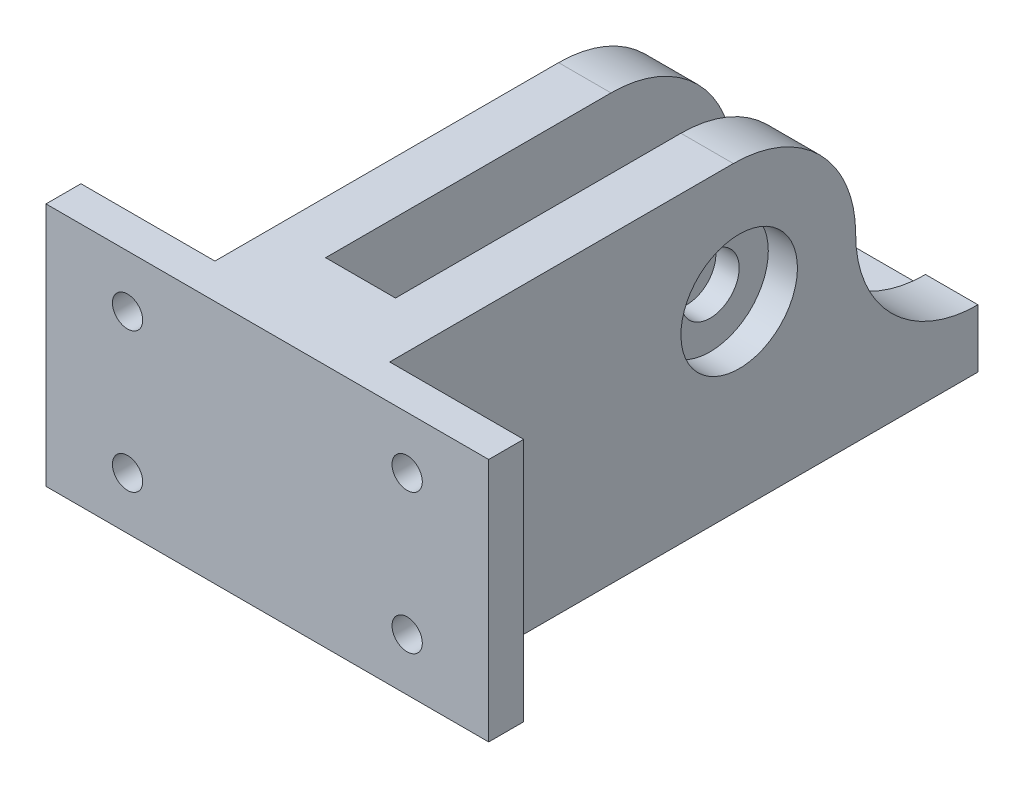
ISO-10303-21;
HEADER;
FILE_DESCRIPTION(('STEP AP214'),'2;1');
FILE_NAME('part.step','',(''),(''),'','','');
FILE_SCHEMA(('AUTOMOTIVE_DESIGN { 1 0 10303 214 1 1 1 1 }'));
ENDSEC;
DATA;
#1=APPLICATION_CONTEXT('core data for automotive mechanical design processes');
#2=APPLICATION_PROTOCOL_DEFINITION('international standard','automotive_design',2000,#1);
#3=PRODUCT_CONTEXT('',#1,'mechanical');
#4=PRODUCT('Part','Part','',(#3));
#5=PRODUCT_RELATED_PRODUCT_CATEGORY('part','',(#4));
#6=PRODUCT_DEFINITION_FORMATION('','',#4);
#7=PRODUCT_DEFINITION_CONTEXT('part definition',#1,'design');
#8=PRODUCT_DEFINITION('design','',#6,#7);
#9=PRODUCT_DEFINITION_SHAPE('','',#8);
#10=(LENGTH_UNIT() NAMED_UNIT(*) SI_UNIT(.MILLI.,.METRE.));
#11=(NAMED_UNIT(*) PLANE_ANGLE_UNIT() SI_UNIT($,.RADIAN.));
#12=(NAMED_UNIT(*) SI_UNIT($,.STERADIAN.) SOLID_ANGLE_UNIT());
#13=UNCERTAINTY_MEASURE_WITH_UNIT(LENGTH_MEASURE(1.E-05),#10,'distance_accuracy_value','');
#14=(GEOMETRIC_REPRESENTATION_CONTEXT(3) GLOBAL_UNCERTAINTY_ASSIGNED_CONTEXT((#13)) GLOBAL_UNIT_ASSIGNED_CONTEXT((#10,
#11,#12)) REPRESENTATION_CONTEXT('',''));
#15=CARTESIAN_POINT('',(0.,0.,0.));
#16=DIRECTION('',(0.,0.,1.));
#17=DIRECTION('',(1.,0.,0.));
#18=AXIS2_PLACEMENT_3D('',#15,#16,#17);
#19=CARTESIAN_POINT('',(-30.3337448559671,-14.862962962963,-50.5));
#20=DIRECTION('',(0.,0.,1.));
#21=DIRECTION('',(1.,0.,0.));
#22=AXIS2_PLACEMENT_3D('',#19,#20,#21);
#23=PLANE('',#22);
#24=DIRECTION('',(0.,-1.,0.));
#25=VECTOR('',#24,1.);
#26=CARTESIAN_POINT('',(-19.8337448559671,-14.862962962963,-50.5));
#27=LINE('',#26,#25);
#28=CARTESIAN_POINT('',(-19.8337448559671,-9.86296296296297,-50.5));
#29=VERTEX_POINT('',#28);
#30=CARTESIAN_POINT('',(-19.8337448559671,-10.862962962963,-50.5));
#31=VERTEX_POINT('',#30);
#32=EDGE_CURVE('E179',#29,#31,#27,.T.);
#33=ORIENTED_EDGE('',*,*,#32,.F.);
#34=DIRECTION('',(1.,0.,0.));
#35=VECTOR('',#34,1.);
#36=CARTESIAN_POINT('',(-30.3337448559671,-9.86296296296297,-50.5));
#37=LINE('',#36,#35);
#38=CARTESIAN_POINT('',(-15.3337448559671,-9.86296296296297,-50.5));
#39=VERTEX_POINT('',#38);
#40=EDGE_CURVE('E205',#29,#39,#37,.T.);
#41=ORIENTED_EDGE('',*,*,#40,.T.);
#42=DIRECTION('',(0.,1.,0.));
#43=VECTOR('',#42,1.);
#44=CARTESIAN_POINT('',(-15.3337448559671,-14.862962962963,-50.5));
#45=LINE('',#44,#43);
#46=CARTESIAN_POINT('',(-15.3337448559671,-14.862962962963,-50.5));
#47=VERTEX_POINT('',#46);
#48=EDGE_CURVE('E201',#47,#39,#45,.T.);
#49=ORIENTED_EDGE('',*,*,#48,.F.);
#50=DIRECTION('',(1.,0.,0.));
#51=VECTOR('',#50,1.);
#52=CARTESIAN_POINT('',(-30.3337448559671,-14.862962962963,-50.5));
#53=LINE('',#52,#51);
#54=CARTESIAN_POINT('',(-30.3337448559671,-14.862962962963,-50.5));
#55=VERTEX_POINT('',#54);
#56=EDGE_CURVE('E196',#55,#47,#53,.T.);
#57=ORIENTED_EDGE('',*,*,#56,.F.);
#58=DIRECTION('',(0.,1.,0.));
#59=VECTOR('',#58,1.);
#60=CARTESIAN_POINT('',(-30.3337448559671,-14.862962962963,-50.5));
#61=LINE('',#60,#59);
#62=CARTESIAN_POINT('',(-30.3337448559671,-9.86296296296297,-50.5));
#63=VERTEX_POINT('',#62);
#64=EDGE_CURVE('E209',#55,#63,#61,.T.);
#65=ORIENTED_EDGE('',*,*,#64,.T.);
#66=CARTESIAN_POINT('',(-25.8337448559671,-9.86296296296297,-50.5));
#67=VERTEX_POINT('',#66);
#68=EDGE_CURVE('E202',#63,#67,#37,.T.);
#69=ORIENTED_EDGE('',*,*,#68,.T.);
#70=DIRECTION('',(0.,1.,0.));
#71=VECTOR('',#70,1.);
#72=CARTESIAN_POINT('',(-25.8337448559671,-14.862962962963,-50.5));
#73=LINE('',#72,#71);
#74=CARTESIAN_POINT('',(-25.8337448559671,-10.862962962963,-50.5));
#75=VERTEX_POINT('',#74);
#76=EDGE_CURVE('E182',#75,#67,#73,.T.);
#77=ORIENTED_EDGE('',*,*,#76,.F.);
#78=DIRECTION('',(-1.,0.,0.));
#79=VECTOR('',#78,1.);
#80=CARTESIAN_POINT('',(-30.3337448559671,-10.862962962963,-50.5));
#81=LINE('',#80,#79);
#82=EDGE_CURVE('E11',#31,#75,#81,.T.);
#83=ORIENTED_EDGE('',*,*,#82,.F.);
#84=EDGE_LOOP('',(#33,#41,#49,#57,#65,#69,#77,#83));
#85=FACE_BOUND('',#84,.T.);
#86=ADVANCED_FACE('F41',(#85),#23,.F.);
#87=CARTESIAN_POINT('',(-41.8337448559671,-9.86296296296297,3.));
#88=DIRECTION('',(0.,1.,0.));
#89=DIRECTION('',(0.,0.,1.));
#90=AXIS2_PLACEMENT_3D('',#87,#88,#89);
#91=PLANE('',#90);
#92=DIRECTION('',(-1.,0.,0.));
#93=VECTOR('',#92,1.);
#94=CARTESIAN_POINT('',(-30.3337448559671,-9.86296296296297,0.));
#95=LINE('',#94,#93);
#96=CARTESIAN_POINT('',(-15.3337448559671,-9.86296296296297,0.));
#97=VERTEX_POINT('',#96);
#98=CARTESIAN_POINT('',(-30.3337448559671,-9.86296296296297,0.));
#99=VERTEX_POINT('',#98);
#100=EDGE_CURVE('E197',#97,#99,#95,.T.);
#101=ORIENTED_EDGE('',*,*,#100,.F.);
#102=DIRECTION('',(1.,0.,0.));
#103=VECTOR('',#102,1.);
#104=CARTESIAN_POINT('',(-41.8337448559671,-9.86296296296297,0.));
#105=LINE('',#104,#103);
#106=CARTESIAN_POINT('',(-3.83374485596708,-9.86296296296297,0.));
#107=VERTEX_POINT('',#106);
#108=EDGE_CURVE('E279',#97,#107,#105,.T.);
#109=ORIENTED_EDGE('',*,*,#108,.T.);
#110=DIRECTION('',(0.,0.,-1.));
#111=VECTOR('',#110,1.);
#112=CARTESIAN_POINT('',(-3.83374485596708,-9.86296296296297,3.));
#113=LINE('',#112,#111);
#114=CARTESIAN_POINT('',(-3.83374485596708,-9.86296296296297,3.));
#115=VERTEX_POINT('',#114);
#116=EDGE_CURVE('E293',#115,#107,#113,.T.);
#117=ORIENTED_EDGE('',*,*,#116,.F.);
#118=DIRECTION('',(1.,0.,0.));
#119=VECTOR('',#118,1.);
#120=CARTESIAN_POINT('',(-41.8337448559671,-9.86296296296297,3.));
#121=LINE('',#120,#119);
#122=CARTESIAN_POINT('',(-41.8337448559671,-9.86296296296297,3.));
#123=VERTEX_POINT('',#122);
#124=EDGE_CURVE('E269',#123,#115,#121,.T.);
#125=ORIENTED_EDGE('',*,*,#124,.F.);
#126=DIRECTION('',(0.,0.,-1.));
#127=VECTOR('',#126,1.);
#128=CARTESIAN_POINT('',(-41.8337448559671,-9.86296296296297,3.));
#129=LINE('',#128,#127);
#130=CARTESIAN_POINT('',(-41.8337448559671,-9.86296296296297,0.));
#131=VERTEX_POINT('',#130);
#132=EDGE_CURVE('E296',#123,#131,#129,.T.);
#133=ORIENTED_EDGE('',*,*,#132,.T.);
#134=EDGE_CURVE('E280',#131,#99,#105,.T.);
#135=ORIENTED_EDGE('',*,*,#134,.T.);
#136=EDGE_LOOP('',(#101,#109,#117,#125,#133,#135));
#137=FACE_BOUND('',#136,.T.);
#138=ADVANCED_FACE('F343',(#137),#91,.F.);
#139=CARTESIAN_POINT('',(-75.3337448559671,0.637037037037043,-30.));
#140=DIRECTION('',(1.,0.,0.));
#141=DIRECTION('',(0.,1.,0.));
#142=AXIS2_PLACEMENT_3D('',#139,#140,#141);
#143=CYLINDRICAL_SURFACE('',#142,5.);
#144=CARTESIAN_POINT('',(-30.3337448559671,0.637037037037035,-30.));
#145=DIRECTION('',(1.,0.,0.));
#146=DIRECTION('',(0.,1.,0.));
#147=AXIS2_PLACEMENT_3D('',#144,#145,#146);
#148=CIRCLE('',#147,5.);
#149=CARTESIAN_POINT('',(-30.3337448559671,5.63703703703703,-30.));
#150=VERTEX_POINT('',#149);
#151=EDGE_CURVE('E231',#150,#150,#148,.T.);
#152=ORIENTED_EDGE('',*,*,#151,.F.);
#153=EDGE_LOOP('',(#152));
#154=FACE_BOUND('',#153,.T.);
#155=CARTESIAN_POINT('',(-27.8337448559671,0.637037037037035,-30.));
#156=DIRECTION('',(1.,0.,0.));
#157=DIRECTION('',(0.,1.,0.));
#158=AXIS2_PLACEMENT_3D('',#155,#156,#157);
#159=CIRCLE('',#158,5.);
#160=CARTESIAN_POINT('',(-27.8337448559671,5.63703703703703,-30.));
#161=VERTEX_POINT('',#160);
#162=EDGE_CURVE('E304',#161,#161,#159,.F.);
#163=ORIENTED_EDGE('',*,*,#162,.F.);
#164=EDGE_LOOP('',(#163));
#165=FACE_BOUND('',#164,.T.);
#166=ADVANCED_FACE('F418',(#154,#165),#143,.F.);
#167=CARTESIAN_POINT('',(-15.3337448559671,0.637037037037032,-30.));
#168=DIRECTION('',(1.,0.,0.));
#169=DIRECTION('',(0.,1.,0.));
#170=AXIS2_PLACEMENT_3D('',#167,#168,#169);
#171=CIRCLE('',#170,5.);
#172=CARTESIAN_POINT('',(-15.3337448559671,5.63703703703703,-30.));
#173=VERTEX_POINT('',#172);
#174=EDGE_CURVE('E226',#173,#173,#171,.T.);
#175=ORIENTED_EDGE('',*,*,#174,.T.);
#176=EDGE_LOOP('',(#175));
#177=FACE_BOUND('',#176,.T.);
#178=CARTESIAN_POINT('',(-17.8337448559671,0.637037037037033,-30.));
#179=DIRECTION('',(-1.,0.,0.));
#180=DIRECTION('',(0.,-1.,0.));
#181=AXIS2_PLACEMENT_3D('',#178,#179,#180);
#182=CIRCLE('',#181,5.);
#183=CARTESIAN_POINT('',(-17.8337448559671,-4.36296296296296,-30.));
#184=VERTEX_POINT('',#183);
#185=EDGE_CURVE('E299',#184,#184,#182,.F.);
#186=ORIENTED_EDGE('',*,*,#185,.F.);
#187=EDGE_LOOP('',(#186));
#188=FACE_BOUND('',#187,.T.);
#189=ADVANCED_FACE('F441',(#177,#188),#143,.F.);
#190=CARTESIAN_POINT('',(0.,0.,0.));
#191=DIRECTION('',(0.,0.,1.));
#192=DIRECTION('',(1.,0.,0.));
#193=AXIS2_PLACEMENT_3D('',#190,#191,#192);
#194=PLANE('',#193);
#195=CARTESIAN_POINT('',(-10.8337448559671,-5.36296296296297,0.));
#196=DIRECTION('',(0.,0.,-1.));
#197=DIRECTION('',(-1.,0.,0.));
#198=AXIS2_PLACEMENT_3D('',#195,#196,#197);
#199=CIRCLE('',#198,1.3);
#200=CARTESIAN_POINT('',(-12.1337448559671,-5.36296296296297,0.));
#201=VERTEX_POINT('',#200);
#202=EDGE_CURVE('E261',#201,#201,#199,.T.);
#203=ORIENTED_EDGE('',*,*,#202,.F.);
#204=EDGE_LOOP('',(#203));
#205=FACE_BOUND('',#204,.T.);
#206=CARTESIAN_POINT('',(-10.8337448559671,6.63703703703703,0.));
#207=DIRECTION('',(0.,0.,-1.));
#208=DIRECTION('',(-1.,0.,0.));
#209=AXIS2_PLACEMENT_3D('',#206,#207,#208);
#210=CIRCLE('',#209,1.3);
#211=CARTESIAN_POINT('',(-12.1337448559671,6.63703703703703,0.));
#212=VERTEX_POINT('',#211);
#213=EDGE_CURVE('E258',#212,#212,#210,.T.);
#214=ORIENTED_EDGE('',*,*,#213,.F.);
#215=EDGE_LOOP('',(#214));
#216=FACE_BOUND('',#215,.T.);
#217=DIRECTION('',(0.,-1.,0.));
#218=VECTOR('',#217,1.);
#219=CARTESIAN_POINT('',(-15.3337448559671,11.137037037037,0.));
#220=LINE('',#219,#218);
#221=CARTESIAN_POINT('',(-15.3337448559671,11.137037037037,0.));
#222=VERTEX_POINT('',#221);
#223=EDGE_CURVE('E232',#222,#97,#220,.T.);
#224=ORIENTED_EDGE('',*,*,#223,.F.);
#225=DIRECTION('',(-1.,0.,0.));
#226=VECTOR('',#225,1.);
#227=CARTESIAN_POINT('',(-41.8337448559671,11.137037037037,0.));
#228=LINE('',#227,#226);
#229=CARTESIAN_POINT('',(-3.83374485596708,11.137037037037,0.));
#230=VERTEX_POINT('',#229);
#231=EDGE_CURVE('E270',#230,#222,#228,.T.);
#232=ORIENTED_EDGE('',*,*,#231,.F.);
#233=DIRECTION('',(0.,1.,0.));
#234=VECTOR('',#233,1.);
#235=CARTESIAN_POINT('',(-3.83374485596708,11.137037037037,0.));
#236=LINE('',#235,#234);
#237=EDGE_CURVE('E283',#107,#230,#236,.T.);
#238=ORIENTED_EDGE('',*,*,#237,.F.);
#239=ORIENTED_EDGE('',*,*,#108,.F.);
#240=EDGE_LOOP('',(#224,#232,#238,#239));
#241=FACE_BOUND('',#240,.T.);
#242=ADVANCED_FACE('F376',(#205,#216,#241),#194,.F.);
#243=CARTESIAN_POINT('',(-34.8337448559671,-5.36296296296297,0.));
#244=DIRECTION('',(0.,0.,-1.));
#245=DIRECTION('',(-1.,0.,0.));
#246=AXIS2_PLACEMENT_3D('',#243,#244,#245);
#247=CIRCLE('',#246,1.3);
#248=CARTESIAN_POINT('',(-36.1337448559671,-5.36296296296297,0.));
#249=VERTEX_POINT('',#248);
#250=EDGE_CURVE('E241',#249,#249,#247,.T.);
#251=ORIENTED_EDGE('',*,*,#250,.F.);
#252=EDGE_LOOP('',(#251));
#253=FACE_BOUND('',#252,.T.);
#254=CARTESIAN_POINT('',(-34.8337448559671,6.63703703703703,0.));
#255=DIRECTION('',(0.,0.,-1.));
#256=DIRECTION('',(-1.,0.,0.));
#257=AXIS2_PLACEMENT_3D('',#254,#255,#256);
#258=CIRCLE('',#257,1.3);
#259=CARTESIAN_POINT('',(-36.1337448559671,6.63703703703703,0.));
#260=VERTEX_POINT('',#259);
#261=EDGE_CURVE('E246',#260,#260,#258,.T.);
#262=ORIENTED_EDGE('',*,*,#261,.F.);
#263=EDGE_LOOP('',(#262));
#264=FACE_BOUND('',#263,.T.);
#265=DIRECTION('',(0.,1.,0.));
#266=VECTOR('',#265,1.);
#267=CARTESIAN_POINT('',(-30.3337448559671,11.137037037037,0.));
#268=LINE('',#267,#266);
#269=CARTESIAN_POINT('',(-30.3337448559671,11.137037037037,0.));
#270=VERTEX_POINT('',#269);
#271=EDGE_CURVE('E234',#99,#270,#268,.T.);
#272=ORIENTED_EDGE('',*,*,#271,.F.);
#273=ORIENTED_EDGE('',*,*,#134,.F.);
#274=DIRECTION('',(0.,-1.,0.));
#275=VECTOR('',#274,1.);
#276=CARTESIAN_POINT('',(-41.8337448559671,11.137037037037,0.));
#277=LINE('',#276,#275);
#278=CARTESIAN_POINT('',(-41.8337448559671,11.137037037037,0.));
#279=VERTEX_POINT('',#278);
#280=EDGE_CURVE('E257',#279,#131,#277,.T.);
#281=ORIENTED_EDGE('',*,*,#280,.F.);
#282=EDGE_CURVE('E285',#270,#279,#228,.T.);
#283=ORIENTED_EDGE('',*,*,#282,.F.);
#284=EDGE_LOOP('',(#272,#273,#281,#283));
#285=FACE_BOUND('',#284,.T.);
#286=ADVANCED_FACE('F349',(#253,#264,#285),#194,.F.);
#287=CARTESIAN_POINT('',(-41.8337448559671,11.137037037037,3.));
#288=DIRECTION('',(1.,0.,0.));
#289=DIRECTION('',(0.,0.,-1.));
#290=AXIS2_PLACEMENT_3D('',#287,#288,#289);
#291=PLANE('',#290);
#292=ORIENTED_EDGE('',*,*,#280,.T.);
#293=ORIENTED_EDGE('',*,*,#132,.F.);
#294=DIRECTION('',(0.,-1.,0.));
#295=VECTOR('',#294,1.);
#296=CARTESIAN_POINT('',(-41.8337448559671,11.137037037037,3.));
#297=LINE('',#296,#295);
#298=CARTESIAN_POINT('',(-41.8337448559671,11.137037037037,3.));
#299=VERTEX_POINT('',#298);
#300=EDGE_CURVE('E266',#299,#123,#297,.T.);
#301=ORIENTED_EDGE('',*,*,#300,.F.);
#302=DIRECTION('',(0.,0.,-1.));
#303=VECTOR('',#302,1.);
#304=CARTESIAN_POINT('',(-41.8337448559671,11.137037037037,3.));
#305=LINE('',#304,#303);
#306=EDGE_CURVE('E276',#299,#279,#305,.T.);
#307=ORIENTED_EDGE('',*,*,#306,.T.);
#308=EDGE_LOOP('',(#292,#293,#301,#307));
#309=FACE_BOUND('',#308,.T.);
#310=ADVANCED_FACE('F386',(#309),#291,.F.);
#311=CARTESIAN_POINT('',(-3.83374485596708,11.137037037037,3.));
#312=DIRECTION('',(-1.,0.,0.));
#313=DIRECTION('',(0.,0.,1.));
#314=AXIS2_PLACEMENT_3D('',#311,#312,#313);
#315=PLANE('',#314);
#316=ORIENTED_EDGE('',*,*,#237,.T.);
#317=DIRECTION('',(0.,0.,-1.));
#318=VECTOR('',#317,1.);
#319=CARTESIAN_POINT('',(-3.83374485596708,11.137037037037,3.));
#320=LINE('',#319,#318);
#321=CARTESIAN_POINT('',(-3.83374485596708,11.137037037037,3.));
#322=VERTEX_POINT('',#321);
#323=EDGE_CURVE('E290',#322,#230,#320,.T.);
#324=ORIENTED_EDGE('',*,*,#323,.F.);
#325=DIRECTION('',(0.,1.,0.));
#326=VECTOR('',#325,1.);
#327=CARTESIAN_POINT('',(-3.83374485596708,11.137037037037,3.));
#328=LINE('',#327,#326);
#329=EDGE_CURVE('E272',#115,#322,#328,.T.);
#330=ORIENTED_EDGE('',*,*,#329,.F.);
#331=ORIENTED_EDGE('',*,*,#116,.T.);
#332=EDGE_LOOP('',(#316,#324,#330,#331));
#333=FACE_BOUND('',#332,.T.);
#334=ADVANCED_FACE('F380',(#333),#315,.F.);
#335=CARTESIAN_POINT('',(-41.8337448559671,11.137037037037,3.));
#336=DIRECTION('',(0.,-1.,0.));
#337=DIRECTION('',(0.,0.,-1.));
#338=AXIS2_PLACEMENT_3D('',#335,#336,#337);
#339=PLANE('',#338);
#340=DIRECTION('',(0.,0.,1.));
#341=VECTOR('',#340,1.);
#342=CARTESIAN_POINT('',(-15.3337448559671,11.137037037037,-40.));
#343=LINE('',#342,#341);
#344=CARTESIAN_POINT('',(-15.3337448559671,11.137037037037,-29.5));
#345=VERTEX_POINT('',#344);
#346=EDGE_CURVE('E237',#345,#222,#343,.T.);
#347=ORIENTED_EDGE('',*,*,#346,.F.);
#348=DIRECTION('',(1.,0.,0.));
#349=VECTOR('',#348,1.);
#350=CARTESIAN_POINT('',(-19.8337448559671,11.137037037037,-29.5));
#351=LINE('',#350,#349);
#352=CARTESIAN_POINT('',(-19.8337448559671,11.137037037037,-29.5));
#353=VERTEX_POINT('',#352);
#354=EDGE_CURVE('E313',#345,#353,#351,.F.);
#355=ORIENTED_EDGE('',*,*,#354,.T.);
#356=DIRECTION('',(0.,0.,-1.));
#357=VECTOR('',#356,1.);
#358=CARTESIAN_POINT('',(-19.8337448559671,11.137037037037,-5.));
#359=LINE('',#358,#357);
#360=CARTESIAN_POINT('',(-19.8337448559671,11.137037037037,-5.));
#361=VERTEX_POINT('',#360);
#362=EDGE_CURVE('E224',#361,#353,#359,.T.);
#363=ORIENTED_EDGE('',*,*,#362,.F.);
#364=DIRECTION('',(1.,0.,0.));
#365=VECTOR('',#364,1.);
#366=CARTESIAN_POINT('',(-19.8337448559671,11.137037037037,-5.));
#367=LINE('',#366,#365);
#368=CARTESIAN_POINT('',(-25.8337448559671,11.137037037037,-5.));
#369=VERTEX_POINT('',#368);
#370=EDGE_CURVE('E168',#369,#361,#367,.T.);
#371=ORIENTED_EDGE('',*,*,#370,.F.);
#372=DIRECTION('',(0.,0.,-1.));
#373=VECTOR('',#372,1.);
#374=CARTESIAN_POINT('',(-25.8337448559671,11.137037037037,-5.));
#375=LINE('',#374,#373);
#376=CARTESIAN_POINT('',(-25.8337448559671,11.137037037037,-29.5));
#377=VERTEX_POINT('',#376);
#378=EDGE_CURVE('E223',#369,#377,#375,.T.);
#379=ORIENTED_EDGE('',*,*,#378,.T.);
#380=DIRECTION('',(1.,0.,0.));
#381=VECTOR('',#380,1.);
#382=CARTESIAN_POINT('',(-30.3337448559671,11.137037037037,-29.5));
#383=LINE('',#382,#381);
#384=CARTESIAN_POINT('',(-30.3337448559671,11.137037037037,-29.5));
#385=VERTEX_POINT('',#384);
#386=EDGE_CURVE('E311',#377,#385,#383,.F.);
#387=ORIENTED_EDGE('',*,*,#386,.T.);
#388=DIRECTION('',(0.,0.,1.));
#389=VECTOR('',#388,1.);
#390=CARTESIAN_POINT('',(-30.3337448559671,11.137037037037,-40.));
#391=LINE('',#390,#389);
#392=EDGE_CURVE('E239',#385,#270,#391,.T.);
#393=ORIENTED_EDGE('',*,*,#392,.T.);
#394=ORIENTED_EDGE('',*,*,#282,.T.);
#395=ORIENTED_EDGE('',*,*,#306,.F.);
#396=DIRECTION('',(-1.,0.,0.));
#397=VECTOR('',#396,1.);
#398=CARTESIAN_POINT('',(-41.8337448559671,11.137037037037,3.));
#399=LINE('',#398,#397);
#400=EDGE_CURVE('E274',#322,#299,#399,.T.);
#401=ORIENTED_EDGE('',*,*,#400,.F.);
#402=ORIENTED_EDGE('',*,*,#323,.T.);
#403=ORIENTED_EDGE('',*,*,#231,.T.);
#404=EDGE_LOOP('',(#347,#355,#363,#371,#379,#387,#393,#394,#395,#401,#402,#403));
#405=FACE_BOUND('',#404,.T.);
#406=ADVANCED_FACE('F370',(#405),#339,.F.);
#407=CARTESIAN_POINT('',(0.,0.,3.));
#408=DIRECTION('',(0.,0.,1.));
#409=DIRECTION('',(1.,0.,0.));
#410=AXIS2_PLACEMENT_3D('',#407,#408,#409);
#411=PLANE('',#410);
#412=CARTESIAN_POINT('',(-34.8337448559671,6.63703703703703,3.));
#413=DIRECTION('',(0.,0.,-1.));
#414=DIRECTION('',(-1.,0.,0.));
#415=AXIS2_PLACEMENT_3D('',#412,#413,#414);
#416=CIRCLE('',#415,1.3);
#417=CARTESIAN_POINT('',(-36.1337448559671,6.63703703703703,3.));
#418=VERTEX_POINT('',#417);
#419=EDGE_CURVE('E242',#418,#418,#416,.T.);
#420=ORIENTED_EDGE('',*,*,#419,.T.);
#421=EDGE_LOOP('',(#420));
#422=FACE_BOUND('',#421,.T.);
#423=CARTESIAN_POINT('',(-34.8337448559671,-5.36296296296297,3.));
#424=DIRECTION('',(0.,0.,-1.));
#425=DIRECTION('',(-1.,0.,0.));
#426=AXIS2_PLACEMENT_3D('',#423,#424,#425);
#427=CIRCLE('',#426,1.3);
#428=CARTESIAN_POINT('',(-36.1337448559671,-5.36296296296297,3.));
#429=VERTEX_POINT('',#428);
#430=EDGE_CURVE('E249',#429,#429,#427,.T.);
#431=ORIENTED_EDGE('',*,*,#430,.T.);
#432=EDGE_LOOP('',(#431));
#433=FACE_BOUND('',#432,.T.);
#434=CARTESIAN_POINT('',(-10.8337448559671,6.63703703703703,3.));
#435=DIRECTION('',(0.,0.,-1.));
#436=DIRECTION('',(-1.,0.,0.));
#437=AXIS2_PLACEMENT_3D('',#434,#435,#436);
#438=CIRCLE('',#437,1.3);
#439=CARTESIAN_POINT('',(-12.1337448559671,6.63703703703703,3.));
#440=VERTEX_POINT('',#439);
#441=EDGE_CURVE('E254',#440,#440,#438,.T.);
#442=ORIENTED_EDGE('',*,*,#441,.T.);
#443=EDGE_LOOP('',(#442));
#444=FACE_BOUND('',#443,.T.);
#445=CARTESIAN_POINT('',(-10.8337448559671,-5.36296296296297,3.));
#446=DIRECTION('',(0.,0.,-1.));
#447=DIRECTION('',(-1.,0.,0.));
#448=AXIS2_PLACEMENT_3D('',#445,#446,#447);
#449=CIRCLE('',#448,1.3);
#450=CARTESIAN_POINT('',(-12.1337448559671,-5.36296296296297,3.));
#451=VERTEX_POINT('',#450);
#452=EDGE_CURVE('E245',#451,#451,#449,.T.);
#453=ORIENTED_EDGE('',*,*,#452,.T.);
#454=EDGE_LOOP('',(#453));
#455=FACE_BOUND('',#454,.T.);
#456=ORIENTED_EDGE('',*,*,#300,.T.);
#457=ORIENTED_EDGE('',*,*,#124,.T.);
#458=ORIENTED_EDGE('',*,*,#329,.T.);
#459=ORIENTED_EDGE('',*,*,#400,.T.);
#460=EDGE_LOOP('',(#456,#457,#458,#459));
#461=FACE_BOUND('',#460,.T.);
#462=ADVANCED_FACE('F382',(#422,#433,#444,#455,#461),#411,.T.);
#463=CARTESIAN_POINT('',(-10.8337448559671,-5.36296296296297,3.));
#464=DIRECTION('',(0.,0.,-1.));
#465=DIRECTION('',(-1.,0.,0.));
#466=AXIS2_PLACEMENT_3D('',#463,#464,#465);
#467=CYLINDRICAL_SURFACE('',#466,1.3);
#468=ORIENTED_EDGE('',*,*,#452,.F.);
#469=EDGE_LOOP('',(#468));
#470=FACE_BOUND('',#469,.T.);
#471=ORIENTED_EDGE('',*,*,#202,.T.);
#472=EDGE_LOOP('',(#471));
#473=FACE_BOUND('',#472,.T.);
#474=ADVANCED_FACE('F469',(#470,#473),#467,.F.);
#475=CARTESIAN_POINT('',(-10.8337448559671,6.63703703703703,3.));
#476=DIRECTION('',(0.,0.,-1.));
#477=DIRECTION('',(-1.,0.,0.));
#478=AXIS2_PLACEMENT_3D('',#475,#476,#477);
#479=CYLINDRICAL_SURFACE('',#478,1.3);
#480=ORIENTED_EDGE('',*,*,#441,.F.);
#481=EDGE_LOOP('',(#480));
#482=FACE_BOUND('',#481,.T.);
#483=ORIENTED_EDGE('',*,*,#213,.T.);
#484=EDGE_LOOP('',(#483));
#485=FACE_BOUND('',#484,.T.);
#486=ADVANCED_FACE('F465',(#482,#485),#479,.F.);
#487=CARTESIAN_POINT('',(-34.8337448559671,-5.36296296296297,3.));
#488=DIRECTION('',(0.,0.,-1.));
#489=DIRECTION('',(-1.,0.,0.));
#490=AXIS2_PLACEMENT_3D('',#487,#488,#489);
#491=CYLINDRICAL_SURFACE('',#490,1.3);
#492=ORIENTED_EDGE('',*,*,#430,.F.);
#493=EDGE_LOOP('',(#492));
#494=FACE_BOUND('',#493,.T.);
#495=ORIENTED_EDGE('',*,*,#250,.T.);
#496=EDGE_LOOP('',(#495));
#497=FACE_BOUND('',#496,.T.);
#498=ADVANCED_FACE('F461',(#494,#497),#491,.F.);
#499=CARTESIAN_POINT('',(-34.8337448559671,6.63703703703703,3.));
#500=DIRECTION('',(0.,0.,-1.));
#501=DIRECTION('',(-1.,0.,0.));
#502=AXIS2_PLACEMENT_3D('',#499,#500,#501);
#503=CYLINDRICAL_SURFACE('',#502,1.3);
#504=ORIENTED_EDGE('',*,*,#419,.F.);
#505=EDGE_LOOP('',(#504));
#506=FACE_BOUND('',#505,.T.);
#507=ORIENTED_EDGE('',*,*,#261,.T.);
#508=EDGE_LOOP('',(#507));
#509=FACE_BOUND('',#508,.T.);
#510=ADVANCED_FACE('F458',(#506,#509),#503,.F.);
#511=CARTESIAN_POINT('',(-15.3337448559671,11.137037037037,-40.));
#512=DIRECTION('',(-1.,0.,0.));
#513=DIRECTION('',(0.,-1.,0.));
#514=AXIS2_PLACEMENT_3D('',#511,#512,#513);
#515=PLANE('',#514);
#516=ORIENTED_EDGE('',*,*,#174,.F.);
#517=EDGE_LOOP('',(#516));
#518=FACE_BOUND('',#517,.T.);
#519=ORIENTED_EDGE('',*,*,#223,.T.);
#520=CARTESIAN_POINT('',(-15.3337448559671,-9.86296296296297,-5.));
#521=DIRECTION('',(-1.,0.,0.));
#522=DIRECTION('',(0.,-1.,0.));
#523=AXIS2_PLACEMENT_3D('',#520,#521,#522);
#524=CIRCLE('',#523,5.);
#525=CARTESIAN_POINT('',(-15.3337448559671,-14.862962962963,-5.));
#526=VERTEX_POINT('',#525);
#527=EDGE_CURVE('E49',#97,#526,#524,.F.);
#528=ORIENTED_EDGE('',*,*,#527,.T.);
#529=DIRECTION('',(0.,0.,1.));
#530=VECTOR('',#529,1.);
#531=CARTESIAN_POINT('',(-15.3337448559671,-14.862962962963,0.));
#532=LINE('',#531,#530);
#533=EDGE_CURVE('E199',#47,#526,#532,.T.);
#534=ORIENTED_EDGE('',*,*,#533,.F.);
#535=ORIENTED_EDGE('',*,*,#48,.T.);
#536=CARTESIAN_POINT('',(-15.3337448559671,0.637037037037033,-50.5));
#537=DIRECTION('',(-1.,0.,0.));
#538=DIRECTION('',(0.,-1.,0.));
#539=AXIS2_PLACEMENT_3D('',#536,#537,#538);
#540=CIRCLE('',#539,10.5);
#541=CARTESIAN_POINT('',(-15.3337448559671,0.637037037037037,-40.));
#542=VERTEX_POINT('',#541);
#543=EDGE_CURVE('E323',#39,#542,#540,.T.);
#544=ORIENTED_EDGE('',*,*,#543,.T.);
#545=CARTESIAN_POINT('',(-15.3337448559671,0.637037037037033,-29.5));
#546=DIRECTION('',(-1.,0.,0.));
#547=DIRECTION('',(0.,-1.,0.));
#548=AXIS2_PLACEMENT_3D('',#545,#546,#547);
#549=CIRCLE('',#548,10.5);
#550=EDGE_CURVE('E307',#542,#345,#549,.F.);
#551=ORIENTED_EDGE('',*,*,#550,.T.);
#552=ORIENTED_EDGE('',*,*,#346,.T.);
#553=EDGE_LOOP('',(#519,#528,#534,#535,#544,#551,#552));
#554=FACE_BOUND('',#553,.T.);
#555=ADVANCED_FACE('F354',(#518,#554),#515,.F.);
#556=CARTESIAN_POINT('',(-30.3337448559671,11.137037037037,-40.));
#557=DIRECTION('',(1.,0.,0.));
#558=DIRECTION('',(0.,1.,0.));
#559=AXIS2_PLACEMENT_3D('',#556,#557,#558);
#560=PLANE('',#559);
#561=ORIENTED_EDGE('',*,*,#151,.T.);
#562=EDGE_LOOP('',(#561));
#563=FACE_BOUND('',#562,.T.);
#564=DIRECTION('',(0.,0.,-1.));
#565=VECTOR('',#564,1.);
#566=CARTESIAN_POINT('',(-30.3337448559671,-14.862962962963,0.));
#567=LINE('',#566,#565);
#568=CARTESIAN_POINT('',(-30.3337448559671,-14.862962962963,-5.));
#569=VERTEX_POINT('',#568);
#570=EDGE_CURVE('E194',#569,#55,#567,.T.);
#571=ORIENTED_EDGE('',*,*,#570,.F.);
#572=CARTESIAN_POINT('',(-30.3337448559671,-9.86296296296297,-5.));
#573=DIRECTION('',(1.,0.,0.));
#574=DIRECTION('',(0.,1.,0.));
#575=AXIS2_PLACEMENT_3D('',#572,#573,#574);
#576=CIRCLE('',#575,5.);
#577=EDGE_CURVE('E63',#569,#99,#576,.F.);
#578=ORIENTED_EDGE('',*,*,#577,.T.);
#579=ORIENTED_EDGE('',*,*,#271,.T.);
#580=ORIENTED_EDGE('',*,*,#392,.F.);
#581=CARTESIAN_POINT('',(-30.3337448559671,0.637037037037033,-29.5));
#582=DIRECTION('',(1.,0.,0.));
#583=DIRECTION('',(0.,1.,0.));
#584=AXIS2_PLACEMENT_3D('',#581,#582,#583);
#585=CIRCLE('',#584,10.5);
#586=CARTESIAN_POINT('',(-30.3337448559671,0.637037037037037,-40.));
#587=VERTEX_POINT('',#586);
#588=EDGE_CURVE('E319',#385,#587,#585,.F.);
#589=ORIENTED_EDGE('',*,*,#588,.T.);
#590=CARTESIAN_POINT('',(-30.3337448559671,0.637037037037033,-50.5));
#591=DIRECTION('',(1.,0.,0.));
#592=DIRECTION('',(0.,1.,0.));
#593=AXIS2_PLACEMENT_3D('',#590,#591,#592);
#594=CIRCLE('',#593,10.5);
#595=EDGE_CURVE('E325',#587,#63,#594,.T.);
#596=ORIENTED_EDGE('',*,*,#595,.T.);
#597=ORIENTED_EDGE('',*,*,#64,.F.);
#598=EDGE_LOOP('',(#571,#578,#579,#580,#589,#596,#597));
#599=FACE_BOUND('',#598,.T.);
#600=ADVANCED_FACE('F338',(#563,#599),#560,.F.);
#601=CARTESIAN_POINT('',(-19.8337448559671,11.137037037037,-5.));
#602=DIRECTION('',(1.,0.,0.));
#603=DIRECTION('',(0.,1.,0.));
#604=AXIS2_PLACEMENT_3D('',#601,#602,#603);
#605=PLANE('',#604);
#606=CARTESIAN_POINT('',(-19.8337448559671,0.637037037037033,-30.));
#607=DIRECTION('',(1.,0.,0.));
#608=DIRECTION('',(0.,1.,0.));
#609=AXIS2_PLACEMENT_3D('',#606,#607,#608);
#610=CIRCLE('',#609,2.5);
#611=CARTESIAN_POINT('',(-19.8337448559671,3.13703703703704,-30.));
#612=VERTEX_POINT('',#611);
#613=EDGE_CURVE('E173',#612,#612,#610,.T.);
#614=ORIENTED_EDGE('',*,*,#613,.T.);
#615=EDGE_LOOP('',(#614));
#616=FACE_BOUND('',#615,.T.);
#617=ORIENTED_EDGE('',*,*,#362,.T.);
#618=CARTESIAN_POINT('',(-19.8337448559671,0.637037037037033,-29.5));
#619=DIRECTION('',(1.,0.,0.));
#620=DIRECTION('',(0.,1.,0.));
#621=AXIS2_PLACEMENT_3D('',#618,#619,#620);
#622=CIRCLE('',#621,10.5);
#623=CARTESIAN_POINT('',(-19.8337448559671,0.637037037037037,-40.));
#624=VERTEX_POINT('',#623);
#625=EDGE_CURVE('E315',#353,#624,#622,.F.);
#626=ORIENTED_EDGE('',*,*,#625,.T.);
#627=CARTESIAN_POINT('',(-19.8337448559671,0.637037037037033,-50.5));
#628=DIRECTION('',(1.,0.,0.));
#629=DIRECTION('',(0.,1.,0.));
#630=AXIS2_PLACEMENT_3D('',#627,#628,#629);
#631=CIRCLE('',#630,10.5);
#632=EDGE_CURVE('E321',#624,#29,#631,.T.);
#633=ORIENTED_EDGE('',*,*,#632,.T.);
#634=ORIENTED_EDGE('',*,*,#32,.T.);
#635=DIRECTION('',(0.,0.,1.));
#636=VECTOR('',#635,1.);
#637=CARTESIAN_POINT('',(-19.8337448559671,-10.862962962963,-105.));
#638=LINE('',#637,#636);
#639=CARTESIAN_POINT('',(-19.8337448559671,-10.862962962963,-5.));
#640=VERTEX_POINT('',#639);
#641=EDGE_CURVE('E176',#31,#640,#638,.T.);
#642=ORIENTED_EDGE('',*,*,#641,.T.);
#643=DIRECTION('',(0.,-1.,0.));
#644=VECTOR('',#643,1.);
#645=CARTESIAN_POINT('',(-19.8337448559671,11.137037037037,-5.));
#646=LINE('',#645,#644);
#647=EDGE_CURVE('E161',#361,#640,#646,.T.);
#648=ORIENTED_EDGE('',*,*,#647,.F.);
#649=EDGE_LOOP('',(#617,#626,#633,#634,#642,#648));
#650=FACE_BOUND('',#649,.T.);
#651=ADVANCED_FACE('F177',(#616,#650),#605,.F.);
#652=CARTESIAN_POINT('',(-25.8337448559671,11.137037037037,-5.));
#653=DIRECTION('',(-1.,0.,0.));
#654=DIRECTION('',(0.,-1.,0.));
#655=AXIS2_PLACEMENT_3D('',#652,#653,#654);
#656=PLANE('',#655);
#657=CARTESIAN_POINT('',(-25.8337448559671,0.637037037037034,-30.));
#658=DIRECTION('',(-1.,0.,0.));
#659=DIRECTION('',(0.,-1.,0.));
#660=AXIS2_PLACEMENT_3D('',#657,#658,#659);
#661=CIRCLE('',#660,2.5);
#662=CARTESIAN_POINT('',(-25.8337448559671,-1.86296296296297,-30.));
#663=VERTEX_POINT('',#662);
#664=EDGE_CURVE('E216',#663,#663,#661,.T.);
#665=ORIENTED_EDGE('',*,*,#664,.T.);
#666=EDGE_LOOP('',(#665));
#667=FACE_BOUND('',#666,.T.);
#668=DIRECTION('',(0.,1.,0.));
#669=VECTOR('',#668,1.);
#670=CARTESIAN_POINT('',(-25.8337448559671,11.137037037037,-5.));
#671=LINE('',#670,#669);
#672=CARTESIAN_POINT('',(-25.8337448559671,-10.862962962963,-5.));
#673=VERTEX_POINT('',#672);
#674=EDGE_CURVE('E172',#673,#369,#671,.T.);
#675=ORIENTED_EDGE('',*,*,#674,.F.);
#676=DIRECTION('',(0.,0.,1.));
#677=VECTOR('',#676,1.);
#678=CARTESIAN_POINT('',(-25.8337448559671,-10.862962962963,-105.));
#679=LINE('',#678,#677);
#680=EDGE_CURVE('E183',#75,#673,#679,.T.);
#681=ORIENTED_EDGE('',*,*,#680,.F.);
#682=ORIENTED_EDGE('',*,*,#76,.T.);
#683=CARTESIAN_POINT('',(-25.8337448559671,0.637037037037033,-50.5));
#684=DIRECTION('',(-1.,0.,0.));
#685=DIRECTION('',(0.,-1.,0.));
#686=AXIS2_PLACEMENT_3D('',#683,#684,#685);
#687=CIRCLE('',#686,10.5);
#688=CARTESIAN_POINT('',(-25.8337448559671,0.637037037037037,-40.));
#689=VERTEX_POINT('',#688);
#690=EDGE_CURVE('E327',#67,#689,#687,.T.);
#691=ORIENTED_EDGE('',*,*,#690,.T.);
#692=CARTESIAN_POINT('',(-25.8337448559671,0.637037037037033,-29.5));
#693=DIRECTION('',(-1.,0.,0.));
#694=DIRECTION('',(0.,-1.,0.));
#695=AXIS2_PLACEMENT_3D('',#692,#693,#694);
#696=CIRCLE('',#695,10.5);
#697=EDGE_CURVE('E317',#689,#377,#696,.F.);
#698=ORIENTED_EDGE('',*,*,#697,.T.);
#699=ORIENTED_EDGE('',*,*,#378,.F.);
#700=EDGE_LOOP('',(#675,#681,#682,#691,#698,#699));
#701=FACE_BOUND('',#700,.T.);
#702=ADVANCED_FACE('F400',(#667,#701),#656,.F.);
#703=CARTESIAN_POINT('',(0.,0.,-5.));
#704=DIRECTION('',(0.,0.,-1.));
#705=DIRECTION('',(-1.,0.,0.));
#706=AXIS2_PLACEMENT_3D('',#703,#704,#705);
#707=PLANE('',#706);
#708=ORIENTED_EDGE('',*,*,#647,.T.);
#709=DIRECTION('',(-1.,0.,0.));
#710=VECTOR('',#709,1.);
#711=CARTESIAN_POINT('',(-19.8337448559671,-10.862962962963,-5.));
#712=LINE('',#711,#710);
#713=EDGE_CURVE('E166',#640,#673,#712,.T.);
#714=ORIENTED_EDGE('',*,*,#713,.T.);
#715=ORIENTED_EDGE('',*,*,#674,.T.);
#716=ORIENTED_EDGE('',*,*,#370,.T.);
#717=EDGE_LOOP('',(#708,#714,#715,#716));
#718=FACE_BOUND('',#717,.T.);
#719=ADVANCED_FACE('F163',(#718),#707,.T.);
#720=CARTESIAN_POINT('',(-17.8337448559671,0.637037037037033,-30.));
#721=DIRECTION('',(-1.,0.,0.));
#722=DIRECTION('',(0.,-1.,0.));
#723=AXIS2_PLACEMENT_3D('',#720,#721,#722);
#724=PLANE('',#723);
#725=CARTESIAN_POINT('',(-17.8337448559671,0.637037037037033,-30.));
#726=DIRECTION('',(1.,0.,0.));
#727=DIRECTION('',(0.,1.,0.));
#728=AXIS2_PLACEMENT_3D('',#725,#726,#727);
#729=CIRCLE('',#728,2.5);
#730=CARTESIAN_POINT('',(-17.8337448559671,3.13703703703704,-30.));
#731=VERTEX_POINT('',#730);
#732=EDGE_CURVE('E212',#731,#731,#729,.T.);
#733=ORIENTED_EDGE('',*,*,#732,.F.);
#734=EDGE_LOOP('',(#733));
#735=FACE_BOUND('',#734,.T.);
#736=ORIENTED_EDGE('',*,*,#185,.T.);
#737=EDGE_LOOP('',(#736));
#738=FACE_BOUND('',#737,.T.);
#739=ADVANCED_FACE('F408',(#735,#738),#724,.F.);
#740=CARTESIAN_POINT('',(-27.8337448559671,0.637037037037034,-30.));
#741=DIRECTION('',(1.,0.,0.));
#742=DIRECTION('',(0.,1.,0.));
#743=AXIS2_PLACEMENT_3D('',#740,#741,#742);
#744=PLANE('',#743);
#745=CARTESIAN_POINT('',(-27.8337448559671,0.637037037037035,-30.));
#746=DIRECTION('',(1.,0.,0.));
#747=DIRECTION('',(0.,1.,0.));
#748=AXIS2_PLACEMENT_3D('',#745,#746,#747);
#749=CIRCLE('',#748,2.5);
#750=CARTESIAN_POINT('',(-27.8337448559671,3.13703703703704,-30.));
#751=VERTEX_POINT('',#750);
#752=EDGE_CURVE('E215',#751,#751,#749,.T.);
#753=ORIENTED_EDGE('',*,*,#752,.T.);
#754=EDGE_LOOP('',(#753));
#755=FACE_BOUND('',#754,.T.);
#756=ORIENTED_EDGE('',*,*,#162,.T.);
#757=EDGE_LOOP('',(#756));
#758=FACE_BOUND('',#757,.T.);
#759=ADVANCED_FACE('F428',(#755,#758),#744,.F.);
#760=CARTESIAN_POINT('',(-37.8337448559671,0.637037037037036,-30.));
#761=DIRECTION('',(1.,0.,0.));
#762=DIRECTION('',(0.,1.,0.));
#763=AXIS2_PLACEMENT_3D('',#760,#761,#762);
#764=CYLINDRICAL_SURFACE('',#763,2.5);
#765=ORIENTED_EDGE('',*,*,#752,.F.);
#766=EDGE_LOOP('',(#765));
#767=FACE_BOUND('',#766,.T.);
#768=ORIENTED_EDGE('',*,*,#664,.F.);
#769=EDGE_LOOP('',(#768));
#770=FACE_BOUND('',#769,.T.);
#771=ADVANCED_FACE('F426',(#767,#770),#764,.F.);
#772=ORIENTED_EDGE('',*,*,#732,.T.);
#773=EDGE_LOOP('',(#772));
#774=FACE_BOUND('',#773,.T.);
#775=ORIENTED_EDGE('',*,*,#613,.F.);
#776=EDGE_LOOP('',(#775));
#777=FACE_BOUND('',#776,.T.);
#778=ADVANCED_FACE('F423',(#774,#777),#764,.F.);
#779=CARTESIAN_POINT('',(0.,-14.862962962963,0.));
#780=DIRECTION('',(0.,-1.,0.));
#781=DIRECTION('',(0.,0.,-1.));
#782=AXIS2_PLACEMENT_3D('',#779,#780,#781);
#783=PLANE('',#782);
#784=ORIENTED_EDGE('',*,*,#533,.T.);
#785=DIRECTION('',(-1.,0.,0.));
#786=VECTOR('',#785,1.);
#787=CARTESIAN_POINT('',(-30.3337448559671,-14.862962962963,-5.));
#788=LINE('',#787,#786);
#789=EDGE_CURVE('E329',#526,#569,#788,.T.);
#790=ORIENTED_EDGE('',*,*,#789,.T.);
#791=ORIENTED_EDGE('',*,*,#570,.T.);
#792=ORIENTED_EDGE('',*,*,#56,.T.);
#793=EDGE_LOOP('',(#784,#790,#791,#792));
#794=FACE_BOUND('',#793,.T.);
#795=ADVANCED_FACE('F351',(#794),#783,.T.);
#796=CARTESIAN_POINT('',(0.,0.637037037037033,-29.5));
#797=DIRECTION('',(-1.,0.,0.));
#798=DIRECTION('',(0.,0.,1.));
#799=AXIS2_PLACEMENT_3D('',#796,#797,#798);
#800=CYLINDRICAL_SURFACE('',#799,10.5);
#801=ORIENTED_EDGE('',*,*,#354,.F.);
#802=ORIENTED_EDGE('',*,*,#550,.F.);
#803=DIRECTION('',(1.,0.,0.));
#804=VECTOR('',#803,1.);
#805=CARTESIAN_POINT('',(-15.3337448559671,0.637037037037033,-40.));
#806=LINE('',#805,#804);
#807=EDGE_CURVE('E330',#624,#542,#806,.T.);
#808=ORIENTED_EDGE('',*,*,#807,.F.);
#809=ORIENTED_EDGE('',*,*,#625,.F.);
#810=EDGE_LOOP('',(#801,#802,#808,#809));
#811=FACE_BOUND('',#810,.T.);
#812=ADVANCED_FACE('F366',(#811),#800,.T.);
#813=CARTESIAN_POINT('',(0.,0.637037037037033,-50.5));
#814=DIRECTION('',(-1.,0.,0.));
#815=DIRECTION('',(0.,0.,1.));
#816=AXIS2_PLACEMENT_3D('',#813,#814,#815);
#817=CYLINDRICAL_SURFACE('',#816,10.5);
#818=ORIENTED_EDGE('',*,*,#543,.F.);
#819=ORIENTED_EDGE('',*,*,#40,.F.);
#820=ORIENTED_EDGE('',*,*,#632,.F.);
#821=ORIENTED_EDGE('',*,*,#807,.T.);
#822=EDGE_LOOP('',(#818,#819,#820,#821));
#823=FACE_BOUND('',#822,.T.);
#824=ADVANCED_FACE('F361',(#823),#817,.F.);
#825=CARTESIAN_POINT('',(0.,0.637037037037033,-29.5));
#826=DIRECTION('',(-1.,0.,0.));
#827=DIRECTION('',(0.,0.,1.));
#828=AXIS2_PLACEMENT_3D('',#825,#826,#827);
#829=CYLINDRICAL_SURFACE('',#828,10.5);
#830=ORIENTED_EDGE('',*,*,#386,.F.);
#831=ORIENTED_EDGE('',*,*,#697,.F.);
#832=DIRECTION('',(1.,0.,0.));
#833=VECTOR('',#832,1.);
#834=CARTESIAN_POINT('',(-25.8337448559671,0.637037037037033,-40.));
#835=LINE('',#834,#833);
#836=EDGE_CURVE('E193',#587,#689,#835,.T.);
#837=ORIENTED_EDGE('',*,*,#836,.F.);
#838=ORIENTED_EDGE('',*,*,#588,.F.);
#839=EDGE_LOOP('',(#830,#831,#837,#838));
#840=FACE_BOUND('',#839,.T.);
#841=ADVANCED_FACE('F391',(#840),#829,.T.);
#842=CARTESIAN_POINT('',(0.,0.637037037037033,-50.5));
#843=DIRECTION('',(-1.,0.,0.));
#844=DIRECTION('',(0.,0.,1.));
#845=AXIS2_PLACEMENT_3D('',#842,#843,#844);
#846=CYLINDRICAL_SURFACE('',#845,10.5);
#847=ORIENTED_EDGE('',*,*,#690,.F.);
#848=ORIENTED_EDGE('',*,*,#68,.F.);
#849=ORIENTED_EDGE('',*,*,#595,.F.);
#850=ORIENTED_EDGE('',*,*,#836,.T.);
#851=EDGE_LOOP('',(#847,#848,#849,#850));
#852=FACE_BOUND('',#851,.T.);
#853=ADVANCED_FACE('F397',(#852),#846,.F.);
#854=CARTESIAN_POINT('',(0.,-9.86296296296297,-5.));
#855=DIRECTION('',(1.,0.,0.));
#856=DIRECTION('',(0.,0.,-1.));
#857=AXIS2_PLACEMENT_3D('',#854,#855,#856);
#858=CYLINDRICAL_SURFACE('',#857,5.);
#859=ORIENTED_EDGE('',*,*,#527,.F.);
#860=ORIENTED_EDGE('',*,*,#100,.T.);
#861=ORIENTED_EDGE('',*,*,#577,.F.);
#862=ORIENTED_EDGE('',*,*,#789,.F.);
#863=EDGE_LOOP('',(#859,#860,#861,#862));
#864=FACE_BOUND('',#863,.T.);
#865=ADVANCED_FACE('F43',(#864),#858,.T.);
#866=CARTESIAN_POINT('',(-19.8337448559671,-10.862962962963,-105.));
#867=DIRECTION('',(0.,1.,0.));
#868=DIRECTION('',(-1.,0.,0.));
#869=AXIS2_PLACEMENT_3D('',#866,#867,#868);
#870=PLANE('',#869);
#871=ORIENTED_EDGE('',*,*,#82,.T.);
#872=ORIENTED_EDGE('',*,*,#680,.T.);
#873=ORIENTED_EDGE('',*,*,#713,.F.);
#874=ORIENTED_EDGE('',*,*,#641,.F.);
#875=EDGE_LOOP('',(#871,#872,#873,#874));
#876=FACE_BOUND('',#875,.T.);
#877=ADVANCED_FACE('F186',(#876),#870,.T.);
#878=CLOSED_SHELL('',(#86,#138,#166,#189,#242,#286,#310,#334,#406,#462,#474,#486,#498,#510,#555,
#600,#651,#702,#719,#739,#759,#771,#778,#795,#812,#824,#841,#853,#865,#877));
#879=MANIFOLD_SOLID_BREP('B2',#878);
#880=ADVANCED_BREP_SHAPE_REPRESENTATION('',(#18,#879),#14);
#881=SHAPE_DEFINITION_REPRESENTATION(#9,#880);
ENDSEC;
END-ISO-10303-21;
